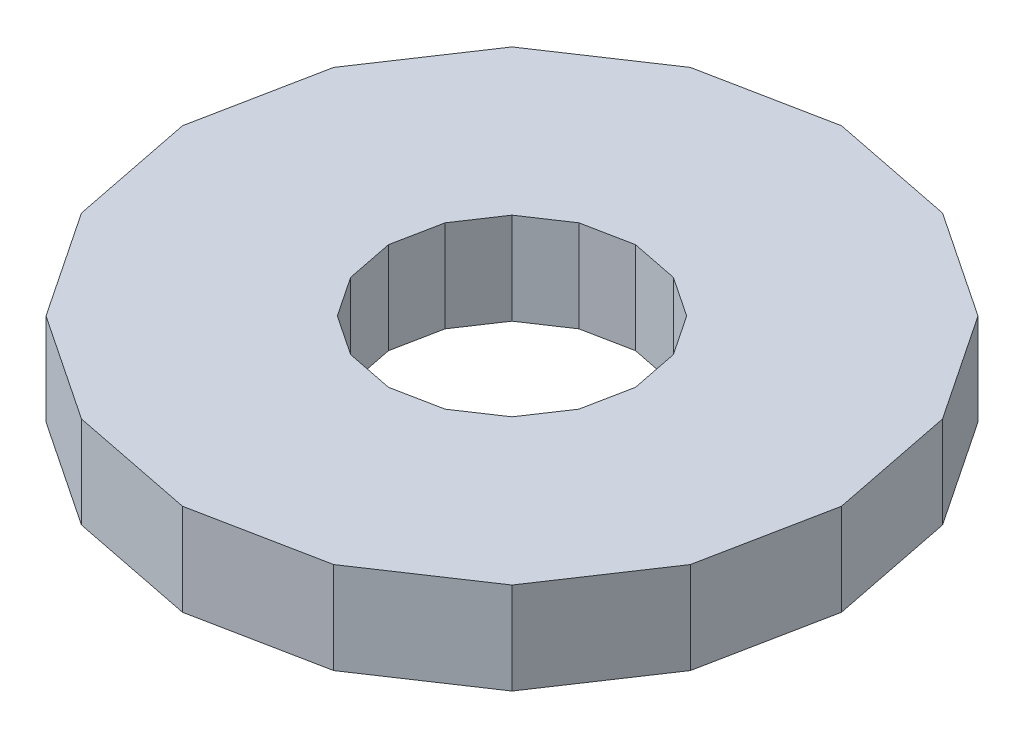
ISO-10303-21;
HEADER;
FILE_DESCRIPTION(('STEP AP214'),'2;1');
FILE_NAME('part.step','',(''),(''),'','','');
FILE_SCHEMA(('AUTOMOTIVE_DESIGN { 1 0 10303 214 1 1 1 1 }'));
ENDSEC;
DATA;
#1=APPLICATION_CONTEXT('core data for automotive mechanical design processes');
#2=APPLICATION_PROTOCOL_DEFINITION('international standard','automotive_design',2000,#1);
#3=PRODUCT_CONTEXT('',#1,'mechanical');
#4=PRODUCT('Part','Part','',(#3));
#5=PRODUCT_RELATED_PRODUCT_CATEGORY('part','',(#4));
#6=PRODUCT_DEFINITION_FORMATION('','',#4);
#7=PRODUCT_DEFINITION_CONTEXT('part definition',#1,'design');
#8=PRODUCT_DEFINITION('design','',#6,#7);
#9=PRODUCT_DEFINITION_SHAPE('','',#8);
#10=(LENGTH_UNIT() NAMED_UNIT(*) SI_UNIT(.MILLI.,.METRE.));
#11=(NAMED_UNIT(*) PLANE_ANGLE_UNIT() SI_UNIT($,.RADIAN.));
#12=(NAMED_UNIT(*) SI_UNIT($,.STERADIAN.) SOLID_ANGLE_UNIT());
#13=UNCERTAINTY_MEASURE_WITH_UNIT(LENGTH_MEASURE(1.E-05),#10,'distance_accuracy_value','');
#14=(GEOMETRIC_REPRESENTATION_CONTEXT(3) GLOBAL_UNCERTAINTY_ASSIGNED_CONTEXT((#13)) GLOBAL_UNIT_ASSIGNED_CONTEXT((#10,
#11,#12)) REPRESENTATION_CONTEXT('',''));
#15=CARTESIAN_POINT('',(0.,0.,0.));
#16=DIRECTION('',(0.,0.,1.));
#17=DIRECTION('',(1.,0.,0.));
#18=AXIS2_PLACEMENT_3D('',#15,#16,#17);
#19=CARTESIAN_POINT('',(0.,19.05,0.));
#20=DIRECTION('',(0.,1.,0.));
#21=DIRECTION('',(0.,0.,1.));
#22=AXIS2_PLACEMENT_3D('',#19,#20,#21);
#23=PLANE('',#22);
#24=DIRECTION('',(-0.195090322016128,0.,0.980785280403231));
#25=VECTOR('',#24,1.);
#26=CARTESIAN_POINT('',(-63.1498961030959,19.05,-26.1575434283542));
#27=LINE('',#26,#25);
#28=CARTESIAN_POINT('',(-63.1498961030959,19.05,-26.1575434283542));
#29=VERTEX_POINT('',#28);
#30=CARTESIAN_POINT('',(-68.352954991266,19.05,0.));
#31=VERTEX_POINT('',#30);
#32=EDGE_CURVE('E363',#29,#31,#27,.T.);
#33=ORIENTED_EDGE('',*,*,#32,.T.);
#34=DIRECTION('',(0.19509032201613,0.,0.98078528040323));
#35=VECTOR('',#34,1.);
#36=CARTESIAN_POINT('',(-68.352954991266,19.05,0.));
#37=LINE('',#36,#35);
#38=CARTESIAN_POINT('',(-63.1498961030958,19.05,26.1575434283542));
#39=VERTEX_POINT('',#38);
#40=EDGE_CURVE('E366',#31,#39,#37,.T.);
#41=ORIENTED_EDGE('',*,*,#40,.T.);
#42=DIRECTION('',(0.555570233019602,0.,0.831469612302545));
#43=VECTOR('',#42,1.);
#44=CARTESIAN_POINT('',(-63.1498961030958,19.05,26.1575434283542));
#45=LINE('',#44,#43);
#46=CARTESIAN_POINT('',(-48.3328379884631,19.05,48.3328379884631));
#47=VERTEX_POINT('',#46);
#48=EDGE_CURVE('E369',#39,#47,#45,.T.);
#49=ORIENTED_EDGE('',*,*,#48,.T.);
#50=DIRECTION('',(0.831469612302545,0.,0.555570233019602));
#51=VECTOR('',#50,1.);
#52=CARTESIAN_POINT('',(-48.3328379884631,19.05,48.3328379884631));
#53=LINE('',#52,#51);
#54=CARTESIAN_POINT('',(-26.1575434283542,19.05,63.1498961030958));
#55=VERTEX_POINT('',#54);
#56=EDGE_CURVE('E371',#47,#55,#53,.T.);
#57=ORIENTED_EDGE('',*,*,#56,.T.);
#58=DIRECTION('',(0.980785280403231,0.,0.195090322016127));
#59=VECTOR('',#58,1.);
#60=CARTESIAN_POINT('',(-26.1575434283542,19.05,63.1498961030958));
#61=LINE('',#60,#59);
#62=CARTESIAN_POINT('',(1.52321087825693E-13,19.05,68.352954991266));
#63=VERTEX_POINT('',#62);
#64=EDGE_CURVE('E373',#55,#63,#61,.T.);
#65=ORIENTED_EDGE('',*,*,#64,.T.);
#66=DIRECTION('',(0.98078528040323,0.,-0.195090322016128));
#67=VECTOR('',#66,1.);
#68=CARTESIAN_POINT('',(1.52321087825693E-13,19.05,68.352954991266));
#69=LINE('',#68,#67);
#70=CARTESIAN_POINT('',(26.1575434283542,19.05,63.1498961030959));
#71=VERTEX_POINT('',#70);
#72=EDGE_CURVE('E375',#63,#71,#69,.T.);
#73=ORIENTED_EDGE('',*,*,#72,.T.);
#74=DIRECTION('',(0.831469612302545,0.,-0.555570233019603));
#75=VECTOR('',#74,1.);
#76=CARTESIAN_POINT('',(26.1575434283542,19.05,63.1498961030959));
#77=LINE('',#76,#75);
#78=CARTESIAN_POINT('',(48.3328379884631,19.05,48.332837988463));
#79=VERTEX_POINT('',#78);
#80=EDGE_CURVE('E377',#71,#79,#77,.T.);
#81=ORIENTED_EDGE('',*,*,#80,.T.);
#82=DIRECTION('',(0.555570233019602,0.,-0.831469612302545));
#83=VECTOR('',#82,1.);
#84=CARTESIAN_POINT('',(48.3328379884631,19.05,48.332837988463));
#85=LINE('',#84,#83);
#86=CARTESIAN_POINT('',(63.1498961030958,19.05,26.1575434283543));
#87=VERTEX_POINT('',#86);
#88=EDGE_CURVE('E379',#79,#87,#85,.T.);
#89=ORIENTED_EDGE('',*,*,#88,.T.);
#90=DIRECTION('',(0.195090322016127,0.,-0.980785280403231));
#91=VECTOR('',#90,1.);
#92=CARTESIAN_POINT('',(63.1498961030958,19.05,26.1575434283543));
#93=LINE('',#92,#91);
#94=CARTESIAN_POINT('',(68.352954991266,19.05,-1.97560673503709E-13));
#95=VERTEX_POINT('',#94);
#96=EDGE_CURVE('E381',#87,#95,#93,.T.);
#97=ORIENTED_EDGE('',*,*,#96,.T.);
#98=DIRECTION('',(-0.195090322016129,0.,-0.98078528040323));
#99=VECTOR('',#98,1.);
#100=CARTESIAN_POINT('',(68.352954991266,19.05,-1.97560673503709E-13));
#101=LINE('',#100,#99);
#102=CARTESIAN_POINT('',(63.1498961030959,19.05,-26.1575434283542));
#103=VERTEX_POINT('',#102);
#104=EDGE_CURVE('E383',#95,#103,#101,.T.);
#105=ORIENTED_EDGE('',*,*,#104,.T.);
#106=DIRECTION('',(-0.555570233019602,0.,-0.831469612302545));
#107=VECTOR('',#106,1.);
#108=CARTESIAN_POINT('',(63.1498961030959,19.05,-26.1575434283542));
#109=LINE('',#108,#107);
#110=CARTESIAN_POINT('',(48.332837988463,19.05,-48.3328379884632));
#111=VERTEX_POINT('',#110);
#112=EDGE_CURVE('E385',#103,#111,#109,.T.);
#113=ORIENTED_EDGE('',*,*,#112,.T.);
#114=DIRECTION('',(-0.831469612302546,0.,-0.555570233019601));
#115=VECTOR('',#114,1.);
#116=CARTESIAN_POINT('',(48.332837988463,19.05,-48.3328379884632));
#117=LINE('',#116,#115);
#118=CARTESIAN_POINT('',(26.1575434283542,19.05,-63.1498961030959));
#119=VERTEX_POINT('',#118);
#120=EDGE_CURVE('E387',#111,#119,#117,.T.);
#121=ORIENTED_EDGE('',*,*,#120,.T.);
#122=DIRECTION('',(-0.98078528040323,0.,-0.195090322016128));
#123=VECTOR('',#122,1.);
#124=CARTESIAN_POINT('',(26.1575434283542,19.05,-63.1498961030959));
#125=LINE('',#124,#123);
#126=CARTESIAN_POINT('',(0.,19.05,-68.352954991266));
#127=VERTEX_POINT('',#126);
#128=EDGE_CURVE('E389',#119,#127,#125,.T.);
#129=ORIENTED_EDGE('',*,*,#128,.T.);
#130=DIRECTION('',(-0.980785280403231,0.,0.195090322016127));
#131=VECTOR('',#130,1.);
#132=CARTESIAN_POINT('',(0.,19.05,-68.352954991266));
#133=LINE('',#132,#131);
#134=CARTESIAN_POINT('',(-26.1575434283542,19.05,-63.1498961030959));
#135=VERTEX_POINT('',#134);
#136=EDGE_CURVE('E391',#127,#135,#133,.T.);
#137=ORIENTED_EDGE('',*,*,#136,.T.);
#138=DIRECTION('',(-0.831469612302545,0.,0.555570233019603));
#139=VECTOR('',#138,1.);
#140=CARTESIAN_POINT('',(-26.1575434283542,19.05,-63.1498961030959));
#141=LINE('',#140,#139);
#142=CARTESIAN_POINT('',(-48.3328379884631,19.05,-48.3328379884631));
#143=VERTEX_POINT('',#142);
#144=EDGE_CURVE('E393',#135,#143,#141,.T.);
#145=ORIENTED_EDGE('',*,*,#144,.T.);
#146=DIRECTION('',(-0.555570233019602,0.,0.831469612302545));
#147=VECTOR('',#146,1.);
#148=CARTESIAN_POINT('',(-48.3328379884631,19.05,-48.3328379884631));
#149=LINE('',#148,#147);
#150=EDGE_CURVE('E395',#143,#29,#149,.T.);
#151=ORIENTED_EDGE('',*,*,#150,.T.);
#152=EDGE_LOOP('',(#33,#41,#49,#57,#65,#73,#81,#89,#97,#105,#113,#121,#129,#137,#145,#151));
#153=FACE_BOUND('',#152,.T.);
#154=DIRECTION('',(0.195090322016129,0.,0.98078528040323));
#155=VECTOR('',#154,1.);
#156=CARTESIAN_POINT('',(-25.6218895507555,19.05,0.));
#157=LINE('',#156,#155);
#158=CARTESIAN_POINT('',(-25.6218895507555,19.05,0.));
#159=VERTEX_POINT('',#158);
#160=CARTESIAN_POINT('',(-23.6715393402078,19.05,9.80507263696235));
#161=VERTEX_POINT('',#160);
#162=EDGE_CURVE('E250',#159,#161,#157,.T.);
#163=ORIENTED_EDGE('',*,*,#162,.F.);
#164=DIRECTION('',(-0.195090322016128,0.,0.98078528040323));
#165=VECTOR('',#164,1.);
#166=CARTESIAN_POINT('',(-23.6715393402078,19.05,-9.80507263696232));
#167=LINE('',#166,#165);
#168=CARTESIAN_POINT('',(-23.6715393402078,19.05,-9.80507263696232));
#169=VERTEX_POINT('',#168);
#170=EDGE_CURVE('E242',#169,#159,#167,.T.);
#171=ORIENTED_EDGE('',*,*,#170,.F.);
#172=DIRECTION('',(-0.555570233019601,0.,0.831469612302546));
#173=VECTOR('',#172,1.);
#174=CARTESIAN_POINT('',(-18.1174118481519,19.05,-18.1174118481519));
#175=LINE('',#174,#173);
#176=CARTESIAN_POINT('',(-18.117411848152,19.05,-18.1174118481519));
#177=VERTEX_POINT('',#176);
#178=EDGE_CURVE('E291',#177,#169,#175,.T.);
#179=ORIENTED_EDGE('',*,*,#178,.F.);
#180=DIRECTION('',(-0.831469612302545,0.,0.555570233019602));
#181=VECTOR('',#180,1.);
#182=CARTESIAN_POINT('',(-9.80507263696235,19.05,-23.6715393402078));
#183=LINE('',#182,#181);
#184=CARTESIAN_POINT('',(-9.80507263696235,19.05,-23.6715393402078));
#185=VERTEX_POINT('',#184);
#186=EDGE_CURVE('E289',#185,#177,#183,.T.);
#187=ORIENTED_EDGE('',*,*,#186,.F.);
#188=DIRECTION('',(-0.98078528040323,0.,0.195090322016129));
#189=VECTOR('',#188,1.);
#190=CARTESIAN_POINT('',(0.,19.05,-25.6218895507555));
#191=LINE('',#190,#189);
#192=CARTESIAN_POINT('',(0.,19.05,-25.6218895507555));
#193=VERTEX_POINT('',#192);
#194=EDGE_CURVE('E287',#193,#185,#191,.T.);
#195=ORIENTED_EDGE('',*,*,#194,.F.);
#196=DIRECTION('',(-0.98078528040323,0.,-0.195090322016128));
#197=VECTOR('',#196,1.);
#198=CARTESIAN_POINT('',(9.80507263696232,19.05,-23.6715393402078));
#199=LINE('',#198,#197);
#200=CARTESIAN_POINT('',(9.80507263696232,19.05,-23.6715393402078));
#201=VERTEX_POINT('',#200);
#202=EDGE_CURVE('E285',#201,#193,#199,.T.);
#203=ORIENTED_EDGE('',*,*,#202,.F.);
#204=DIRECTION('',(-0.831469612302546,0.,-0.555570233019602));
#205=VECTOR('',#204,1.);
#206=CARTESIAN_POINT('',(18.1174118481519,19.05,-18.1174118481519));
#207=LINE('',#206,#205);
#208=CARTESIAN_POINT('',(18.1174118481519,19.05,-18.1174118481519));
#209=VERTEX_POINT('',#208);
#210=EDGE_CURVE('E283',#209,#201,#207,.T.);
#211=ORIENTED_EDGE('',*,*,#210,.F.);
#212=DIRECTION('',(-0.555570233019603,0.,-0.831469612302545));
#213=VECTOR('',#212,1.);
#214=CARTESIAN_POINT('',(23.6715393402078,19.05,-9.80507263696235));
#215=LINE('',#214,#213);
#216=CARTESIAN_POINT('',(23.6715393402078,19.05,-9.80507263696235));
#217=VERTEX_POINT('',#216);
#218=EDGE_CURVE('E281',#217,#209,#215,.T.);
#219=ORIENTED_EDGE('',*,*,#218,.F.);
#220=DIRECTION('',(-0.195090322016129,0.,-0.980785280403231));
#221=VECTOR('',#220,1.);
#222=CARTESIAN_POINT('',(25.6218895507555,19.05,0.));
#223=LINE('',#222,#221);
#224=CARTESIAN_POINT('',(25.6218895507555,19.05,0.));
#225=VERTEX_POINT('',#224);
#226=EDGE_CURVE('E279',#225,#217,#223,.T.);
#227=ORIENTED_EDGE('',*,*,#226,.F.);
#228=DIRECTION('',(0.195090322016128,0.,-0.98078528040323));
#229=VECTOR('',#228,1.);
#230=CARTESIAN_POINT('',(23.6715393402078,19.05,9.80507263696232));
#231=LINE('',#230,#229);
#232=CARTESIAN_POINT('',(23.6715393402078,19.05,9.80507263696232));
#233=VERTEX_POINT('',#232);
#234=EDGE_CURVE('E277',#233,#225,#231,.T.);
#235=ORIENTED_EDGE('',*,*,#234,.F.);
#236=DIRECTION('',(0.555570233019601,0.,-0.831469612302546));
#237=VECTOR('',#236,1.);
#238=CARTESIAN_POINT('',(18.117411848152,19.05,18.1174118481519));
#239=LINE('',#238,#237);
#240=CARTESIAN_POINT('',(18.117411848152,19.05,18.1174118481519));
#241=VERTEX_POINT('',#240);
#242=EDGE_CURVE('E275',#241,#233,#239,.T.);
#243=ORIENTED_EDGE('',*,*,#242,.F.);
#244=DIRECTION('',(0.831469612302545,0.,-0.555570233019603));
#245=VECTOR('',#244,1.);
#246=CARTESIAN_POINT('',(9.80507263696235,19.05,23.6715393402078));
#247=LINE('',#246,#245);
#248=CARTESIAN_POINT('',(9.80507263696235,19.05,23.6715393402078));
#249=VERTEX_POINT('',#248);
#250=EDGE_CURVE('E273',#249,#241,#247,.T.);
#251=ORIENTED_EDGE('',*,*,#250,.F.);
#252=DIRECTION('',(0.98078528040323,0.,-0.195090322016129));
#253=VECTOR('',#252,1.);
#254=CARTESIAN_POINT('',(0.,19.05,25.6218895507555));
#255=LINE('',#254,#253);
#256=CARTESIAN_POINT('',(0.,19.05,25.6218895507555));
#257=VERTEX_POINT('',#256);
#258=EDGE_CURVE('E271',#257,#249,#255,.T.);
#259=ORIENTED_EDGE('',*,*,#258,.F.);
#260=DIRECTION('',(0.98078528040323,0.,0.195090322016128));
#261=VECTOR('',#260,1.);
#262=CARTESIAN_POINT('',(-9.80507263696231,19.05,23.6715393402078));
#263=LINE('',#262,#261);
#264=CARTESIAN_POINT('',(-9.80507263696231,19.05,23.6715393402078));
#265=VERTEX_POINT('',#264);
#266=EDGE_CURVE('E269',#265,#257,#263,.T.);
#267=ORIENTED_EDGE('',*,*,#266,.F.);
#268=DIRECTION('',(0.831469612302546,0.,0.555570233019602));
#269=VECTOR('',#268,1.);
#270=CARTESIAN_POINT('',(-18.1174118481519,19.05,18.117411848152));
#271=LINE('',#270,#269);
#272=CARTESIAN_POINT('',(-18.1174118481519,19.05,18.117411848152));
#273=VERTEX_POINT('',#272);
#274=EDGE_CURVE('E265',#273,#265,#271,.T.);
#275=ORIENTED_EDGE('',*,*,#274,.F.);
#276=DIRECTION('',(0.555570233019603,0.,0.831469612302545));
#277=VECTOR('',#276,1.);
#278=CARTESIAN_POINT('',(-23.6715393402078,19.05,9.80507263696235));
#279=LINE('',#278,#277);
#280=EDGE_CURVE('E263',#161,#273,#279,.T.);
#281=ORIENTED_EDGE('',*,*,#280,.F.);
#282=EDGE_LOOP('',(#163,#171,#179,#187,#195,#203,#211,#219,#227,#235,#243,#251,#259,#267,#275,#281));
#283=FACE_BOUND('',#282,.T.);
#284=ADVANCED_FACE('F33',(#153,#283),#23,.T.);
#285=CARTESIAN_POINT('',(0.,0.,0.));
#286=DIRECTION('',(0.,1.,0.));
#287=DIRECTION('',(0.,0.,1.));
#288=AXIS2_PLACEMENT_3D('',#285,#286,#287);
#289=PLANE('',#288);
#290=DIRECTION('',(-0.195090322016128,0.,0.980785280403231));
#291=VECTOR('',#290,1.);
#292=CARTESIAN_POINT('',(-63.1498961030959,0.,-26.1575434283542));
#293=LINE('',#292,#291);
#294=CARTESIAN_POINT('',(-63.1498961030959,0.,-26.1575434283542));
#295=VERTEX_POINT('',#294);
#296=CARTESIAN_POINT('',(-68.352954991266,0.,0.));
#297=VERTEX_POINT('',#296);
#298=EDGE_CURVE('E258',#295,#297,#293,.T.);
#299=ORIENTED_EDGE('',*,*,#298,.F.);
#300=DIRECTION('',(-0.555570233019602,0.,0.831469612302545));
#301=VECTOR('',#300,1.);
#302=CARTESIAN_POINT('',(-48.3328379884631,0.,-48.3328379884631));
#303=LINE('',#302,#301);
#304=CARTESIAN_POINT('',(-48.3328379884631,0.,-48.3328379884631));
#305=VERTEX_POINT('',#304);
#306=EDGE_CURVE('E367',#305,#295,#303,.T.);
#307=ORIENTED_EDGE('',*,*,#306,.F.);
#308=DIRECTION('',(-0.831469612302545,0.,0.555570233019603));
#309=VECTOR('',#308,1.);
#310=CARTESIAN_POINT('',(-26.1575434283542,0.,-63.1498961030959));
#311=LINE('',#310,#309);
#312=CARTESIAN_POINT('',(-26.1575434283542,0.,-63.1498961030959));
#313=VERTEX_POINT('',#312);
#314=EDGE_CURVE('E426',#313,#305,#311,.T.);
#315=ORIENTED_EDGE('',*,*,#314,.F.);
#316=DIRECTION('',(-0.980785280403231,0.,0.195090322016127));
#317=VECTOR('',#316,1.);
#318=CARTESIAN_POINT('',(0.,0.,-68.352954991266));
#319=LINE('',#318,#317);
#320=CARTESIAN_POINT('',(0.,0.,-68.352954991266));
#321=VERTEX_POINT('',#320);
#322=EDGE_CURVE('E424',#321,#313,#319,.T.);
#323=ORIENTED_EDGE('',*,*,#322,.F.);
#324=DIRECTION('',(-0.98078528040323,0.,-0.195090322016128));
#325=VECTOR('',#324,1.);
#326=CARTESIAN_POINT('',(26.1575434283542,0.,-63.1498961030959));
#327=LINE('',#326,#325);
#328=CARTESIAN_POINT('',(26.1575434283542,0.,-63.1498961030959));
#329=VERTEX_POINT('',#328);
#330=EDGE_CURVE('E422',#329,#321,#327,.T.);
#331=ORIENTED_EDGE('',*,*,#330,.F.);
#332=DIRECTION('',(-0.831469612302546,0.,-0.555570233019601));
#333=VECTOR('',#332,1.);
#334=CARTESIAN_POINT('',(48.332837988463,0.,-48.3328379884632));
#335=LINE('',#334,#333);
#336=CARTESIAN_POINT('',(48.332837988463,0.,-48.3328379884632));
#337=VERTEX_POINT('',#336);
#338=EDGE_CURVE('E420',#337,#329,#335,.T.);
#339=ORIENTED_EDGE('',*,*,#338,.F.);
#340=DIRECTION('',(-0.555570233019602,0.,-0.831469612302545));
#341=VECTOR('',#340,1.);
#342=CARTESIAN_POINT('',(63.1498961030959,0.,-26.1575434283542));
#343=LINE('',#342,#341);
#344=CARTESIAN_POINT('',(63.1498961030959,0.,-26.1575434283542));
#345=VERTEX_POINT('',#344);
#346=EDGE_CURVE('E418',#345,#337,#343,.T.);
#347=ORIENTED_EDGE('',*,*,#346,.F.);
#348=DIRECTION('',(-0.195090322016129,0.,-0.98078528040323));
#349=VECTOR('',#348,1.);
#350=CARTESIAN_POINT('',(68.352954991266,0.,-1.97560673503709E-13));
#351=LINE('',#350,#349);
#352=CARTESIAN_POINT('',(68.352954991266,0.,-1.97560673503709E-13));
#353=VERTEX_POINT('',#352);
#354=EDGE_CURVE('E416',#353,#345,#351,.T.);
#355=ORIENTED_EDGE('',*,*,#354,.F.);
#356=DIRECTION('',(0.195090322016127,0.,-0.980785280403231));
#357=VECTOR('',#356,1.);
#358=CARTESIAN_POINT('',(63.1498961030958,0.,26.1575434283543));
#359=LINE('',#358,#357);
#360=CARTESIAN_POINT('',(63.1498961030958,0.,26.1575434283543));
#361=VERTEX_POINT('',#360);
#362=EDGE_CURVE('E414',#361,#353,#359,.T.);
#363=ORIENTED_EDGE('',*,*,#362,.F.);
#364=DIRECTION('',(0.555570233019602,0.,-0.831469612302545));
#365=VECTOR('',#364,1.);
#366=CARTESIAN_POINT('',(48.3328379884631,0.,48.332837988463));
#367=LINE('',#366,#365);
#368=CARTESIAN_POINT('',(48.3328379884631,0.,48.332837988463));
#369=VERTEX_POINT('',#368);
#370=EDGE_CURVE('E412',#369,#361,#367,.T.);
#371=ORIENTED_EDGE('',*,*,#370,.F.);
#372=DIRECTION('',(0.831469612302545,0.,-0.555570233019603));
#373=VECTOR('',#372,1.);
#374=CARTESIAN_POINT('',(26.1575434283542,0.,63.1498961030959));
#375=LINE('',#374,#373);
#376=CARTESIAN_POINT('',(26.1575434283542,0.,63.1498961030959));
#377=VERTEX_POINT('',#376);
#378=EDGE_CURVE('E410',#377,#369,#375,.T.);
#379=ORIENTED_EDGE('',*,*,#378,.F.);
#380=DIRECTION('',(0.98078528040323,0.,-0.195090322016128));
#381=VECTOR('',#380,1.);
#382=CARTESIAN_POINT('',(1.52321087825693E-13,0.,68.352954991266));
#383=LINE('',#382,#381);
#384=CARTESIAN_POINT('',(1.52321087825693E-13,0.,68.352954991266));
#385=VERTEX_POINT('',#384);
#386=EDGE_CURVE('E408',#385,#377,#383,.T.);
#387=ORIENTED_EDGE('',*,*,#386,.F.);
#388=DIRECTION('',(0.980785280403231,0.,0.195090322016127));
#389=VECTOR('',#388,1.);
#390=CARTESIAN_POINT('',(-26.1575434283542,0.,63.1498961030958));
#391=LINE('',#390,#389);
#392=CARTESIAN_POINT('',(-26.1575434283542,0.,63.1498961030958));
#393=VERTEX_POINT('',#392);
#394=EDGE_CURVE('E406',#393,#385,#391,.T.);
#395=ORIENTED_EDGE('',*,*,#394,.F.);
#396=DIRECTION('',(0.831469612302545,0.,0.555570233019602));
#397=VECTOR('',#396,1.);
#398=CARTESIAN_POINT('',(-48.3328379884631,0.,48.3328379884631));
#399=LINE('',#398,#397);
#400=CARTESIAN_POINT('',(-48.3328379884631,0.,48.3328379884631));
#401=VERTEX_POINT('',#400);
#402=EDGE_CURVE('E404',#401,#393,#399,.T.);
#403=ORIENTED_EDGE('',*,*,#402,.F.);
#404=DIRECTION('',(0.555570233019602,0.,0.831469612302545));
#405=VECTOR('',#404,1.);
#406=CARTESIAN_POINT('',(-63.1498961030958,0.,26.1575434283542));
#407=LINE('',#406,#405);
#408=CARTESIAN_POINT('',(-63.1498961030958,0.,26.1575434283542));
#409=VERTEX_POINT('',#408);
#410=EDGE_CURVE('E402',#409,#401,#407,.T.);
#411=ORIENTED_EDGE('',*,*,#410,.F.);
#412=DIRECTION('',(0.19509032201613,0.,0.98078528040323));
#413=VECTOR('',#412,1.);
#414=CARTESIAN_POINT('',(-68.352954991266,0.,0.));
#415=LINE('',#414,#413);
#416=EDGE_CURVE('E400',#297,#409,#415,.T.);
#417=ORIENTED_EDGE('',*,*,#416,.F.);
#418=EDGE_LOOP('',(#299,#307,#315,#323,#331,#339,#347,#355,#363,#371,#379,#387,#395,#403,#411,#417));
#419=FACE_BOUND('',#418,.T.);
#420=DIRECTION('',(-0.195090322016128,0.,0.98078528040323));
#421=VECTOR('',#420,1.);
#422=CARTESIAN_POINT('',(-23.6715393402078,0.,-9.80507263696232));
#423=LINE('',#422,#421);
#424=CARTESIAN_POINT('',(-23.6715393402078,0.,-9.80507263696232));
#425=VERTEX_POINT('',#424);
#426=CARTESIAN_POINT('',(-25.6218895507555,0.,0.));
#427=VERTEX_POINT('',#426);
#428=EDGE_CURVE('E56',#425,#427,#423,.T.);
#429=ORIENTED_EDGE('',*,*,#428,.T.);
#430=DIRECTION('',(0.195090322016129,0.,0.98078528040323));
#431=VECTOR('',#430,1.);
#432=CARTESIAN_POINT('',(-25.6218895507555,0.,0.));
#433=LINE('',#432,#431);
#434=CARTESIAN_POINT('',(-23.6715393402078,0.,9.80507263696235));
#435=VERTEX_POINT('',#434);
#436=EDGE_CURVE('E257',#427,#435,#433,.T.);
#437=ORIENTED_EDGE('',*,*,#436,.T.);
#438=DIRECTION('',(0.555570233019603,0.,0.831469612302545));
#439=VECTOR('',#438,1.);
#440=CARTESIAN_POINT('',(-23.6715393402078,0.,9.80507263696235));
#441=LINE('',#440,#439);
#442=CARTESIAN_POINT('',(-18.1174118481519,0.,18.117411848152));
#443=VERTEX_POINT('',#442);
#444=EDGE_CURVE('E295',#435,#443,#441,.T.);
#445=ORIENTED_EDGE('',*,*,#444,.T.);
#446=DIRECTION('',(0.831469612302546,0.,0.555570233019602));
#447=VECTOR('',#446,1.);
#448=CARTESIAN_POINT('',(-18.1174118481519,0.,18.117411848152));
#449=LINE('',#448,#447);
#450=CARTESIAN_POINT('',(-9.80507263696231,0.,23.6715393402078));
#451=VERTEX_POINT('',#450);
#452=EDGE_CURVE('E298',#443,#451,#449,.T.);
#453=ORIENTED_EDGE('',*,*,#452,.T.);
#454=DIRECTION('',(0.98078528040323,0.,0.195090322016128));
#455=VECTOR('',#454,1.);
#456=CARTESIAN_POINT('',(-9.80507263696231,0.,23.6715393402078));
#457=LINE('',#456,#455);
#458=CARTESIAN_POINT('',(0.,0.,25.6218895507555));
#459=VERTEX_POINT('',#458);
#460=EDGE_CURVE('E301',#451,#459,#457,.T.);
#461=ORIENTED_EDGE('',*,*,#460,.T.);
#462=DIRECTION('',(0.98078528040323,0.,-0.195090322016129));
#463=VECTOR('',#462,1.);
#464=CARTESIAN_POINT('',(0.,0.,25.6218895507555));
#465=LINE('',#464,#463);
#466=CARTESIAN_POINT('',(9.80507263696235,0.,23.6715393402078));
#467=VERTEX_POINT('',#466);
#468=EDGE_CURVE('E304',#459,#467,#465,.T.);
#469=ORIENTED_EDGE('',*,*,#468,.T.);
#470=DIRECTION('',(0.831469612302545,0.,-0.555570233019603));
#471=VECTOR('',#470,1.);
#472=CARTESIAN_POINT('',(9.80507263696235,0.,23.6715393402078));
#473=LINE('',#472,#471);
#474=CARTESIAN_POINT('',(18.117411848152,0.,18.1174118481519));
#475=VERTEX_POINT('',#474);
#476=EDGE_CURVE('E307',#467,#475,#473,.T.);
#477=ORIENTED_EDGE('',*,*,#476,.T.);
#478=DIRECTION('',(0.555570233019601,0.,-0.831469612302546));
#479=VECTOR('',#478,1.);
#480=CARTESIAN_POINT('',(18.117411848152,0.,18.1174118481519));
#481=LINE('',#480,#479);
#482=CARTESIAN_POINT('',(23.6715393402078,0.,9.80507263696232));
#483=VERTEX_POINT('',#482);
#484=EDGE_CURVE('E310',#475,#483,#481,.T.);
#485=ORIENTED_EDGE('',*,*,#484,.T.);
#486=DIRECTION('',(0.195090322016128,0.,-0.98078528040323));
#487=VECTOR('',#486,1.);
#488=CARTESIAN_POINT('',(23.6715393402078,0.,9.80507263696232));
#489=LINE('',#488,#487);
#490=CARTESIAN_POINT('',(25.6218895507555,0.,0.));
#491=VERTEX_POINT('',#490);
#492=EDGE_CURVE('E313',#483,#491,#489,.T.);
#493=ORIENTED_EDGE('',*,*,#492,.T.);
#494=DIRECTION('',(-0.195090322016129,0.,-0.980785280403231));
#495=VECTOR('',#494,1.);
#496=CARTESIAN_POINT('',(25.6218895507555,0.,0.));
#497=LINE('',#496,#495);
#498=CARTESIAN_POINT('',(23.6715393402078,0.,-9.80507263696235));
#499=VERTEX_POINT('',#498);
#500=EDGE_CURVE('E316',#491,#499,#497,.T.);
#501=ORIENTED_EDGE('',*,*,#500,.T.);
#502=DIRECTION('',(-0.555570233019603,0.,-0.831469612302545));
#503=VECTOR('',#502,1.);
#504=CARTESIAN_POINT('',(23.6715393402078,0.,-9.80507263696235));
#505=LINE('',#504,#503);
#506=CARTESIAN_POINT('',(18.1174118481519,0.,-18.1174118481519));
#507=VERTEX_POINT('',#506);
#508=EDGE_CURVE('E319',#499,#507,#505,.T.);
#509=ORIENTED_EDGE('',*,*,#508,.T.);
#510=DIRECTION('',(-0.831469612302546,0.,-0.555570233019602));
#511=VECTOR('',#510,1.);
#512=CARTESIAN_POINT('',(18.1174118481519,0.,-18.1174118481519));
#513=LINE('',#512,#511);
#514=CARTESIAN_POINT('',(9.80507263696232,0.,-23.6715393402078));
#515=VERTEX_POINT('',#514);
#516=EDGE_CURVE('E322',#507,#515,#513,.T.);
#517=ORIENTED_EDGE('',*,*,#516,.T.);
#518=DIRECTION('',(-0.98078528040323,0.,-0.195090322016128));
#519=VECTOR('',#518,1.);
#520=CARTESIAN_POINT('',(9.80507263696232,0.,-23.6715393402078));
#521=LINE('',#520,#519);
#522=CARTESIAN_POINT('',(0.,0.,-25.6218895507555));
#523=VERTEX_POINT('',#522);
#524=EDGE_CURVE('E325',#515,#523,#521,.T.);
#525=ORIENTED_EDGE('',*,*,#524,.T.);
#526=DIRECTION('',(-0.98078528040323,0.,0.195090322016129));
#527=VECTOR('',#526,1.);
#528=CARTESIAN_POINT('',(0.,0.,-25.6218895507555));
#529=LINE('',#528,#527);
#530=CARTESIAN_POINT('',(-9.80507263696235,0.,-23.6715393402078));
#531=VERTEX_POINT('',#530);
#532=EDGE_CURVE('E328',#523,#531,#529,.T.);
#533=ORIENTED_EDGE('',*,*,#532,.T.);
#534=DIRECTION('',(-0.831469612302545,0.,0.555570233019602));
#535=VECTOR('',#534,1.);
#536=CARTESIAN_POINT('',(-9.80507263696235,0.,-23.6715393402078));
#537=LINE('',#536,#535);
#538=CARTESIAN_POINT('',(-18.1174118481519,0.,-18.1174118481519));
#539=VERTEX_POINT('',#538);
#540=EDGE_CURVE('E331',#531,#539,#537,.T.);
#541=ORIENTED_EDGE('',*,*,#540,.T.);
#542=DIRECTION('',(-0.555570233019601,0.,0.831469612302546));
#543=VECTOR('',#542,1.);
#544=CARTESIAN_POINT('',(-18.1174118481519,0.,-18.1174118481519));
#545=LINE('',#544,#543);
#546=EDGE_CURVE('E251',#539,#425,#545,.T.);
#547=ORIENTED_EDGE('',*,*,#546,.T.);
#548=EDGE_LOOP('',(#429,#437,#445,#453,#461,#469,#477,#485,#493,#501,#509,#517,#525,#533,#541,#547));
#549=FACE_BOUND('',#548,.T.);
#550=ADVANCED_FACE('F480',(#419,#549),#289,.F.);
#551=CARTESIAN_POINT('',(-63.1498961030959,19.05,-26.1575434283542));
#552=DIRECTION('',(0.98078528040323,0.,0.195090322016128));
#553=DIRECTION('',(0.195090322016128,0.,-0.980785280403231));
#554=AXIS2_PLACEMENT_3D('',#551,#552,#553);
#555=PLANE('',#554);
#556=ORIENTED_EDGE('',*,*,#298,.T.);
#557=DIRECTION('',(0.,-1.,0.));
#558=VECTOR('',#557,1.);
#559=CARTESIAN_POINT('',(-68.352954991266,19.05,0.));
#560=LINE('',#559,#558);
#561=EDGE_CURVE('E11',#31,#297,#560,.T.);
#562=ORIENTED_EDGE('',*,*,#561,.F.);
#563=ORIENTED_EDGE('',*,*,#32,.F.);
#564=DIRECTION('',(0.,-1.,0.));
#565=VECTOR('',#564,1.);
#566=CARTESIAN_POINT('',(-63.1498961030959,19.05,-26.1575434283542));
#567=LINE('',#566,#565);
#568=EDGE_CURVE('E397',#29,#295,#567,.T.);
#569=ORIENTED_EDGE('',*,*,#568,.T.);
#570=EDGE_LOOP('',(#556,#562,#563,#569));
#571=FACE_BOUND('',#570,.T.);
#572=ADVANCED_FACE('F35',(#571),#555,.F.);
#573=CARTESIAN_POINT('',(-68.352954991266,19.05,0.));
#574=DIRECTION('',(0.98078528040323,0.,-0.19509032201613));
#575=DIRECTION('',(-0.19509032201613,0.,-0.98078528040323));
#576=AXIS2_PLACEMENT_3D('',#573,#574,#575);
#577=PLANE('',#576);
#578=ORIENTED_EDGE('',*,*,#416,.T.);
#579=DIRECTION('',(0.,-1.,0.));
#580=VECTOR('',#579,1.);
#581=CARTESIAN_POINT('',(-63.1498961030958,19.05,26.1575434283542));
#582=LINE('',#581,#580);
#583=EDGE_CURVE('E41',#39,#409,#582,.T.);
#584=ORIENTED_EDGE('',*,*,#583,.F.);
#585=ORIENTED_EDGE('',*,*,#40,.F.);
#586=ORIENTED_EDGE('',*,*,#561,.T.);
#587=EDGE_LOOP('',(#578,#584,#585,#586));
#588=FACE_BOUND('',#587,.T.);
#589=ADVANCED_FACE('F497',(#588),#577,.F.);
#590=CARTESIAN_POINT('',(-63.1498961030958,19.05,26.1575434283542));
#591=DIRECTION('',(0.831469612302545,0.,-0.555570233019602));
#592=DIRECTION('',(-0.555570233019602,0.,-0.831469612302545));
#593=AXIS2_PLACEMENT_3D('',#590,#591,#592);
#594=PLANE('',#593);
#595=ORIENTED_EDGE('',*,*,#410,.T.);
#596=DIRECTION('',(0.,-1.,0.));
#597=VECTOR('',#596,1.);
#598=CARTESIAN_POINT('',(-48.3328379884631,19.05,48.3328379884631));
#599=LINE('',#598,#597);
#600=EDGE_CURVE('E467',#47,#401,#599,.T.);
#601=ORIENTED_EDGE('',*,*,#600,.F.);
#602=ORIENTED_EDGE('',*,*,#48,.F.);
#603=ORIENTED_EDGE('',*,*,#583,.T.);
#604=EDGE_LOOP('',(#595,#601,#602,#603));
#605=FACE_BOUND('',#604,.T.);
#606=ADVANCED_FACE('F474',(#605),#594,.F.);
#607=CARTESIAN_POINT('',(-48.3328379884631,19.05,48.3328379884631));
#608=DIRECTION('',(0.555570233019602,0.,-0.831469612302545));
#609=DIRECTION('',(-0.831469612302545,0.,-0.555570233019602));
#610=AXIS2_PLACEMENT_3D('',#607,#608,#609);
#611=PLANE('',#610);
#612=ORIENTED_EDGE('',*,*,#402,.T.);
#613=DIRECTION('',(0.,-1.,0.));
#614=VECTOR('',#613,1.);
#615=CARTESIAN_POINT('',(-26.1575434283542,19.05,63.1498961030958));
#616=LINE('',#615,#614);
#617=EDGE_CURVE('E464',#55,#393,#616,.T.);
#618=ORIENTED_EDGE('',*,*,#617,.F.);
#619=ORIENTED_EDGE('',*,*,#56,.F.);
#620=ORIENTED_EDGE('',*,*,#600,.T.);
#621=EDGE_LOOP('',(#612,#618,#619,#620));
#622=FACE_BOUND('',#621,.T.);
#623=ADVANCED_FACE('F486',(#622),#611,.F.);
#624=CARTESIAN_POINT('',(-26.1575434283542,19.05,63.1498961030958));
#625=DIRECTION('',(0.195090322016127,0.,-0.980785280403231));
#626=DIRECTION('',(-0.980785280403231,0.,-0.195090322016127));
#627=AXIS2_PLACEMENT_3D('',#624,#625,#626);
#628=PLANE('',#627);
#629=ORIENTED_EDGE('',*,*,#394,.T.);
#630=DIRECTION('',(0.,-1.,0.));
#631=VECTOR('',#630,1.);
#632=CARTESIAN_POINT('',(1.52321087825693E-13,19.05,68.352954991266));
#633=LINE('',#632,#631);
#634=EDGE_CURVE('E461',#63,#385,#633,.T.);
#635=ORIENTED_EDGE('',*,*,#634,.F.);
#636=ORIENTED_EDGE('',*,*,#64,.F.);
#637=ORIENTED_EDGE('',*,*,#617,.T.);
#638=EDGE_LOOP('',(#629,#635,#636,#637));
#639=FACE_BOUND('',#638,.T.);
#640=ADVANCED_FACE('F490',(#639),#628,.F.);
#641=CARTESIAN_POINT('',(1.52321087825693E-13,19.05,68.352954991266));
#642=DIRECTION('',(-0.195090322016128,0.,-0.98078528040323));
#643=DIRECTION('',(-0.98078528040323,0.,0.195090322016128));
#644=AXIS2_PLACEMENT_3D('',#641,#642,#643);
#645=PLANE('',#644);
#646=ORIENTED_EDGE('',*,*,#386,.T.);
#647=DIRECTION('',(0.,-1.,0.));
#648=VECTOR('',#647,1.);
#649=CARTESIAN_POINT('',(26.1575434283542,19.05,63.1498961030959));
#650=LINE('',#649,#648);
#651=EDGE_CURVE('E458',#71,#377,#650,.T.);
#652=ORIENTED_EDGE('',*,*,#651,.F.);
#653=ORIENTED_EDGE('',*,*,#72,.F.);
#654=ORIENTED_EDGE('',*,*,#634,.T.);
#655=EDGE_LOOP('',(#646,#652,#653,#654));
#656=FACE_BOUND('',#655,.T.);
#657=ADVANCED_FACE('F550',(#656),#645,.F.);
#658=CARTESIAN_POINT('',(26.1575434283542,19.05,63.1498961030959));
#659=DIRECTION('',(-0.555570233019602,0.,-0.831469612302545));
#660=DIRECTION('',(-0.831469612302545,0.,0.555570233019602));
#661=AXIS2_PLACEMENT_3D('',#658,#659,#660);
#662=PLANE('',#661);
#663=ORIENTED_EDGE('',*,*,#378,.T.);
#664=DIRECTION('',(0.,-1.,0.));
#665=VECTOR('',#664,1.);
#666=CARTESIAN_POINT('',(48.3328379884631,19.05,48.332837988463));
#667=LINE('',#666,#665);
#668=EDGE_CURVE('E455',#79,#369,#667,.T.);
#669=ORIENTED_EDGE('',*,*,#668,.F.);
#670=ORIENTED_EDGE('',*,*,#80,.F.);
#671=ORIENTED_EDGE('',*,*,#651,.T.);
#672=EDGE_LOOP('',(#663,#669,#670,#671));
#673=FACE_BOUND('',#672,.T.);
#674=ADVANCED_FACE('F547',(#673),#662,.F.);
#675=CARTESIAN_POINT('',(48.3328379884631,19.05,48.332837988463));
#676=DIRECTION('',(-0.831469612302545,0.,-0.555570233019602));
#677=DIRECTION('',(-0.555570233019602,0.,0.831469612302545));
#678=AXIS2_PLACEMENT_3D('',#675,#676,#677);
#679=PLANE('',#678);
#680=ORIENTED_EDGE('',*,*,#370,.T.);
#681=DIRECTION('',(0.,-1.,0.));
#682=VECTOR('',#681,1.);
#683=CARTESIAN_POINT('',(63.1498961030958,19.05,26.1575434283543));
#684=LINE('',#683,#682);
#685=EDGE_CURVE('E452',#87,#361,#684,.T.);
#686=ORIENTED_EDGE('',*,*,#685,.F.);
#687=ORIENTED_EDGE('',*,*,#88,.F.);
#688=ORIENTED_EDGE('',*,*,#668,.T.);
#689=EDGE_LOOP('',(#680,#686,#687,#688));
#690=FACE_BOUND('',#689,.T.);
#691=ADVANCED_FACE('F543',(#690),#679,.F.);
#692=CARTESIAN_POINT('',(63.1498961030958,19.05,26.1575434283543));
#693=DIRECTION('',(-0.980785280403231,0.,-0.195090322016127));
#694=DIRECTION('',(-0.195090322016127,0.,0.980785280403231));
#695=AXIS2_PLACEMENT_3D('',#692,#693,#694);
#696=PLANE('',#695);
#697=ORIENTED_EDGE('',*,*,#362,.T.);
#698=DIRECTION('',(0.,-1.,0.));
#699=VECTOR('',#698,1.);
#700=CARTESIAN_POINT('',(68.352954991266,19.05,-1.97560673503709E-13));
#701=LINE('',#700,#699);
#702=EDGE_CURVE('E449',#95,#353,#701,.T.);
#703=ORIENTED_EDGE('',*,*,#702,.F.);
#704=ORIENTED_EDGE('',*,*,#96,.F.);
#705=ORIENTED_EDGE('',*,*,#685,.T.);
#706=EDGE_LOOP('',(#697,#703,#704,#705));
#707=FACE_BOUND('',#706,.T.);
#708=ADVANCED_FACE('F539',(#707),#696,.F.);
#709=CARTESIAN_POINT('',(68.352954991266,19.05,-1.97560673503709E-13));
#710=DIRECTION('',(-0.98078528040323,0.,0.195090322016129));
#711=DIRECTION('',(0.195090322016129,0.,0.98078528040323));
#712=AXIS2_PLACEMENT_3D('',#709,#710,#711);
#713=PLANE('',#712);
#714=ORIENTED_EDGE('',*,*,#354,.T.);
#715=DIRECTION('',(0.,-1.,0.));
#716=VECTOR('',#715,1.);
#717=CARTESIAN_POINT('',(63.1498961030959,19.05,-26.1575434283542));
#718=LINE('',#717,#716);
#719=EDGE_CURVE('E446',#103,#345,#718,.T.);
#720=ORIENTED_EDGE('',*,*,#719,.F.);
#721=ORIENTED_EDGE('',*,*,#104,.F.);
#722=ORIENTED_EDGE('',*,*,#702,.T.);
#723=EDGE_LOOP('',(#714,#720,#721,#722));
#724=FACE_BOUND('',#723,.T.);
#725=ADVANCED_FACE('F534',(#724),#713,.F.);
#726=CARTESIAN_POINT('',(63.1498961030959,19.05,-26.1575434283542));
#727=DIRECTION('',(-0.831469612302545,0.,0.555570233019603));
#728=DIRECTION('',(0.555570233019603,0.,0.831469612302545));
#729=AXIS2_PLACEMENT_3D('',#726,#727,#728);
#730=PLANE('',#729);
#731=ORIENTED_EDGE('',*,*,#346,.T.);
#732=DIRECTION('',(0.,-1.,0.));
#733=VECTOR('',#732,1.);
#734=CARTESIAN_POINT('',(48.332837988463,19.05,-48.3328379884632));
#735=LINE('',#734,#733);
#736=EDGE_CURVE('E443',#111,#337,#735,.T.);
#737=ORIENTED_EDGE('',*,*,#736,.F.);
#738=ORIENTED_EDGE('',*,*,#112,.F.);
#739=ORIENTED_EDGE('',*,*,#719,.T.);
#740=EDGE_LOOP('',(#731,#737,#738,#739));
#741=FACE_BOUND('',#740,.T.);
#742=ADVANCED_FACE('F528',(#741),#730,.F.);
#743=CARTESIAN_POINT('',(48.332837988463,19.05,-48.3328379884632));
#744=DIRECTION('',(-0.555570233019601,0.,0.831469612302546));
#745=DIRECTION('',(0.831469612302546,0.,0.555570233019601));
#746=AXIS2_PLACEMENT_3D('',#743,#744,#745);
#747=PLANE('',#746);
#748=ORIENTED_EDGE('',*,*,#338,.T.);
#749=DIRECTION('',(0.,-1.,0.));
#750=VECTOR('',#749,1.);
#751=CARTESIAN_POINT('',(26.1575434283542,19.05,-63.1498961030959));
#752=LINE('',#751,#750);
#753=EDGE_CURVE('E440',#119,#329,#752,.T.);
#754=ORIENTED_EDGE('',*,*,#753,.F.);
#755=ORIENTED_EDGE('',*,*,#120,.F.);
#756=ORIENTED_EDGE('',*,*,#736,.T.);
#757=EDGE_LOOP('',(#748,#754,#755,#756));
#758=FACE_BOUND('',#757,.T.);
#759=ADVANCED_FACE('F524',(#758),#747,.F.);
#760=CARTESIAN_POINT('',(26.1575434283542,19.05,-63.1498961030959));
#761=DIRECTION('',(-0.195090322016128,0.,0.980785280403231));
#762=DIRECTION('',(0.98078528040323,0.,0.195090322016128));
#763=AXIS2_PLACEMENT_3D('',#760,#761,#762);
#764=PLANE('',#763);
#765=ORIENTED_EDGE('',*,*,#330,.T.);
#766=DIRECTION('',(0.,-1.,0.));
#767=VECTOR('',#766,1.);
#768=CARTESIAN_POINT('',(0.,19.05,-68.352954991266));
#769=LINE('',#768,#767);
#770=EDGE_CURVE('E437',#127,#321,#769,.T.);
#771=ORIENTED_EDGE('',*,*,#770,.F.);
#772=ORIENTED_EDGE('',*,*,#128,.F.);
#773=ORIENTED_EDGE('',*,*,#753,.T.);
#774=EDGE_LOOP('',(#765,#771,#772,#773));
#775=FACE_BOUND('',#774,.T.);
#776=ADVANCED_FACE('F519',(#775),#764,.F.);
#777=CARTESIAN_POINT('',(0.,19.05,-68.352954991266));
#778=DIRECTION('',(0.195090322016127,0.,0.980785280403231));
#779=DIRECTION('',(0.980785280403231,0.,-0.195090322016127));
#780=AXIS2_PLACEMENT_3D('',#777,#778,#779);
#781=PLANE('',#780);
#782=ORIENTED_EDGE('',*,*,#322,.T.);
#783=DIRECTION('',(0.,-1.,0.));
#784=VECTOR('',#783,1.);
#785=CARTESIAN_POINT('',(-26.1575434283542,19.05,-63.1498961030959));
#786=LINE('',#785,#784);
#787=EDGE_CURVE('E434',#135,#313,#786,.T.);
#788=ORIENTED_EDGE('',*,*,#787,.F.);
#789=ORIENTED_EDGE('',*,*,#136,.F.);
#790=ORIENTED_EDGE('',*,*,#770,.T.);
#791=EDGE_LOOP('',(#782,#788,#789,#790));
#792=FACE_BOUND('',#791,.T.);
#793=ADVANCED_FACE('F513',(#792),#781,.F.);
#794=CARTESIAN_POINT('',(-26.1575434283542,19.05,-63.1498961030959));
#795=DIRECTION('',(0.555570233019603,0.,0.831469612302545));
#796=DIRECTION('',(0.831469612302545,0.,-0.555570233019603));
#797=AXIS2_PLACEMENT_3D('',#794,#795,#796);
#798=PLANE('',#797);
#799=ORIENTED_EDGE('',*,*,#314,.T.);
#800=DIRECTION('',(0.,-1.,0.));
#801=VECTOR('',#800,1.);
#802=CARTESIAN_POINT('',(-48.3328379884631,19.05,-48.3328379884631));
#803=LINE('',#802,#801);
#804=EDGE_CURVE('E431',#143,#305,#803,.T.);
#805=ORIENTED_EDGE('',*,*,#804,.F.);
#806=ORIENTED_EDGE('',*,*,#144,.F.);
#807=ORIENTED_EDGE('',*,*,#787,.T.);
#808=EDGE_LOOP('',(#799,#805,#806,#807));
#809=FACE_BOUND('',#808,.T.);
#810=ADVANCED_FACE('F509',(#809),#798,.F.);
#811=CARTESIAN_POINT('',(-48.3328379884631,19.05,-48.3328379884631));
#812=DIRECTION('',(0.831469612302545,0.,0.555570233019602));
#813=DIRECTION('',(0.555570233019602,0.,-0.831469612302545));
#814=AXIS2_PLACEMENT_3D('',#811,#812,#813);
#815=PLANE('',#814);
#816=ORIENTED_EDGE('',*,*,#306,.T.);
#817=ORIENTED_EDGE('',*,*,#568,.F.);
#818=ORIENTED_EDGE('',*,*,#150,.F.);
#819=ORIENTED_EDGE('',*,*,#804,.T.);
#820=EDGE_LOOP('',(#816,#817,#818,#819));
#821=FACE_BOUND('',#820,.T.);
#822=ADVANCED_FACE('F504',(#821),#815,.F.);
#823=CARTESIAN_POINT('',(-23.6715393402078,19.05,-9.80507263696232));
#824=DIRECTION('',(0.98078528040323,0.,0.195090322016128));
#825=DIRECTION('',(0.195090322016129,0.,-0.980785280403231));
#826=AXIS2_PLACEMENT_3D('',#823,#824,#825);
#827=PLANE('',#826);
#828=ORIENTED_EDGE('',*,*,#428,.F.);
#829=DIRECTION('',(0.,-1.,0.));
#830=VECTOR('',#829,1.);
#831=CARTESIAN_POINT('',(-23.6715393402078,19.05,-9.80507263696232));
#832=LINE('',#831,#830);
#833=EDGE_CURVE('E246',#169,#425,#832,.T.);
#834=ORIENTED_EDGE('',*,*,#833,.F.);
#835=ORIENTED_EDGE('',*,*,#170,.T.);
#836=DIRECTION('',(0.,-1.,0.));
#837=VECTOR('',#836,1.);
#838=CARTESIAN_POINT('',(-25.6218895507555,19.05,0.));
#839=LINE('',#838,#837);
#840=EDGE_CURVE('E245',#159,#427,#839,.T.);
#841=ORIENTED_EDGE('',*,*,#840,.T.);
#842=EDGE_LOOP('',(#828,#834,#835,#841));
#843=FACE_BOUND('',#842,.T.);
#844=ADVANCED_FACE('F244',(#843),#827,.T.);
#845=CARTESIAN_POINT('',(-25.6218895507555,19.05,0.));
#846=DIRECTION('',(0.98078528040323,0.,-0.195090322016129));
#847=DIRECTION('',(-0.195090322016129,0.,-0.98078528040323));
#848=AXIS2_PLACEMENT_3D('',#845,#846,#847);
#849=PLANE('',#848);
#850=ORIENTED_EDGE('',*,*,#436,.F.);
#851=ORIENTED_EDGE('',*,*,#840,.F.);
#852=ORIENTED_EDGE('',*,*,#162,.T.);
#853=DIRECTION('',(0.,-1.,0.));
#854=VECTOR('',#853,1.);
#855=CARTESIAN_POINT('',(-23.6715393402078,19.05,9.80507263696235));
#856=LINE('',#855,#854);
#857=EDGE_CURVE('E259',#161,#435,#856,.T.);
#858=ORIENTED_EDGE('',*,*,#857,.T.);
#859=EDGE_LOOP('',(#850,#851,#852,#858));
#860=FACE_BOUND('',#859,.T.);
#861=ADVANCED_FACE('F254',(#860),#849,.T.);
#862=CARTESIAN_POINT('',(-23.6715393402078,19.05,9.80507263696235));
#863=DIRECTION('',(0.831469612302545,0.,-0.555570233019603));
#864=DIRECTION('',(-0.555570233019603,0.,-0.831469612302545));
#865=AXIS2_PLACEMENT_3D('',#862,#863,#864);
#866=PLANE('',#865);
#867=ORIENTED_EDGE('',*,*,#444,.F.);
#868=ORIENTED_EDGE('',*,*,#857,.F.);
#869=ORIENTED_EDGE('',*,*,#280,.T.);
#870=DIRECTION('',(0.,-1.,0.));
#871=VECTOR('',#870,1.);
#872=CARTESIAN_POINT('',(-18.1174118481519,19.05,18.117411848152));
#873=LINE('',#872,#871);
#874=EDGE_CURVE('E360',#273,#443,#873,.T.);
#875=ORIENTED_EDGE('',*,*,#874,.T.);
#876=EDGE_LOOP('',(#867,#868,#869,#875));
#877=FACE_BOUND('',#876,.T.);
#878=ADVANCED_FACE('F632',(#877),#866,.T.);
#879=CARTESIAN_POINT('',(-18.1174118481519,19.05,18.117411848152));
#880=DIRECTION('',(0.555570233019602,0.,-0.831469612302546));
#881=DIRECTION('',(-0.831469612302546,0.,-0.555570233019602));
#882=AXIS2_PLACEMENT_3D('',#879,#880,#881);
#883=PLANE('',#882);
#884=ORIENTED_EDGE('',*,*,#452,.F.);
#885=ORIENTED_EDGE('',*,*,#874,.F.);
#886=ORIENTED_EDGE('',*,*,#274,.T.);
#887=DIRECTION('',(0.,-1.,0.));
#888=VECTOR('',#887,1.);
#889=CARTESIAN_POINT('',(-9.80507263696231,19.05,23.6715393402078));
#890=LINE('',#889,#888);
#891=EDGE_CURVE('E358',#265,#451,#890,.T.);
#892=ORIENTED_EDGE('',*,*,#891,.T.);
#893=EDGE_LOOP('',(#884,#885,#886,#892));
#894=FACE_BOUND('',#893,.T.);
#895=ADVANCED_FACE('F638',(#894),#883,.T.);
#896=CARTESIAN_POINT('',(-9.80507263696231,19.05,23.6715393402078));
#897=DIRECTION('',(0.195090322016128,0.,-0.98078528040323));
#898=DIRECTION('',(-0.98078528040323,0.,-0.195090322016128));
#899=AXIS2_PLACEMENT_3D('',#896,#897,#898);
#900=PLANE('',#899);
#901=ORIENTED_EDGE('',*,*,#460,.F.);
#902=ORIENTED_EDGE('',*,*,#891,.F.);
#903=ORIENTED_EDGE('',*,*,#266,.T.);
#904=DIRECTION('',(0.,-1.,0.));
#905=VECTOR('',#904,1.);
#906=CARTESIAN_POINT('',(0.,19.05,25.6218895507555));
#907=LINE('',#906,#905);
#908=EDGE_CURVE('E356',#257,#459,#907,.T.);
#909=ORIENTED_EDGE('',*,*,#908,.T.);
#910=EDGE_LOOP('',(#901,#902,#903,#909));
#911=FACE_BOUND('',#910,.T.);
#912=ADVANCED_FACE('F646',(#911),#900,.T.);
#913=CARTESIAN_POINT('',(0.,19.05,25.6218895507555));
#914=DIRECTION('',(-0.195090322016129,0.,-0.98078528040323));
#915=DIRECTION('',(-0.98078528040323,0.,0.195090322016129));
#916=AXIS2_PLACEMENT_3D('',#913,#914,#915);
#917=PLANE('',#916);
#918=ORIENTED_EDGE('',*,*,#468,.F.);
#919=ORIENTED_EDGE('',*,*,#908,.F.);
#920=ORIENTED_EDGE('',*,*,#258,.T.);
#921=DIRECTION('',(0.,-1.,0.));
#922=VECTOR('',#921,1.);
#923=CARTESIAN_POINT('',(9.80507263696235,19.05,23.6715393402078));
#924=LINE('',#923,#922);
#925=EDGE_CURVE('E354',#249,#467,#924,.T.);
#926=ORIENTED_EDGE('',*,*,#925,.T.);
#927=EDGE_LOOP('',(#918,#919,#920,#926));
#928=FACE_BOUND('',#927,.T.);
#929=ADVANCED_FACE('F654',(#928),#917,.T.);
#930=CARTESIAN_POINT('',(9.80507263696235,19.05,23.6715393402078));
#931=DIRECTION('',(-0.555570233019603,0.,-0.831469612302545));
#932=DIRECTION('',(-0.831469612302545,0.,0.555570233019603));
#933=AXIS2_PLACEMENT_3D('',#930,#931,#932);
#934=PLANE('',#933);
#935=ORIENTED_EDGE('',*,*,#476,.F.);
#936=ORIENTED_EDGE('',*,*,#925,.F.);
#937=ORIENTED_EDGE('',*,*,#250,.T.);
#938=DIRECTION('',(0.,-1.,0.));
#939=VECTOR('',#938,1.);
#940=CARTESIAN_POINT('',(18.117411848152,19.05,18.1174118481519));
#941=LINE('',#940,#939);
#942=EDGE_CURVE('E352',#241,#475,#941,.T.);
#943=ORIENTED_EDGE('',*,*,#942,.T.);
#944=EDGE_LOOP('',(#935,#936,#937,#943));
#945=FACE_BOUND('',#944,.T.);
#946=ADVANCED_FACE('F662',(#945),#934,.T.);
#947=CARTESIAN_POINT('',(18.117411848152,19.05,18.1174118481519));
#948=DIRECTION('',(-0.831469612302546,0.,-0.555570233019602));
#949=DIRECTION('',(-0.555570233019601,0.,0.831469612302546));
#950=AXIS2_PLACEMENT_3D('',#947,#948,#949);
#951=PLANE('',#950);
#952=ORIENTED_EDGE('',*,*,#484,.F.);
#953=ORIENTED_EDGE('',*,*,#942,.F.);
#954=ORIENTED_EDGE('',*,*,#242,.T.);
#955=DIRECTION('',(0.,-1.,0.));
#956=VECTOR('',#955,1.);
#957=CARTESIAN_POINT('',(23.6715393402078,19.05,9.80507263696232));
#958=LINE('',#957,#956);
#959=EDGE_CURVE('E350',#233,#483,#958,.T.);
#960=ORIENTED_EDGE('',*,*,#959,.T.);
#961=EDGE_LOOP('',(#952,#953,#954,#960));
#962=FACE_BOUND('',#961,.T.);
#963=ADVANCED_FACE('F670',(#962),#951,.T.);
#964=CARTESIAN_POINT('',(23.6715393402078,19.05,9.80507263696232));
#965=DIRECTION('',(-0.980785280403231,0.,-0.195090322016128));
#966=DIRECTION('',(-0.195090322016128,0.,0.98078528040323));
#967=AXIS2_PLACEMENT_3D('',#964,#965,#966);
#968=PLANE('',#967);
#969=ORIENTED_EDGE('',*,*,#492,.F.);
#970=ORIENTED_EDGE('',*,*,#959,.F.);
#971=ORIENTED_EDGE('',*,*,#234,.T.);
#972=DIRECTION('',(0.,-1.,0.));
#973=VECTOR('',#972,1.);
#974=CARTESIAN_POINT('',(25.6218895507555,19.05,0.));
#975=LINE('',#974,#973);
#976=EDGE_CURVE('E348',#225,#491,#975,.T.);
#977=ORIENTED_EDGE('',*,*,#976,.T.);
#978=EDGE_LOOP('',(#969,#970,#971,#977));
#979=FACE_BOUND('',#978,.T.);
#980=ADVANCED_FACE('F678',(#979),#968,.T.);
#981=CARTESIAN_POINT('',(25.6218895507555,19.05,0.));
#982=DIRECTION('',(-0.98078528040323,0.,0.195090322016129));
#983=DIRECTION('',(0.195090322016129,0.,0.98078528040323));
#984=AXIS2_PLACEMENT_3D('',#981,#982,#983);
#985=PLANE('',#984);
#986=ORIENTED_EDGE('',*,*,#500,.F.);
#987=ORIENTED_EDGE('',*,*,#976,.F.);
#988=ORIENTED_EDGE('',*,*,#226,.T.);
#989=DIRECTION('',(0.,-1.,0.));
#990=VECTOR('',#989,1.);
#991=CARTESIAN_POINT('',(23.6715393402078,19.05,-9.80507263696235));
#992=LINE('',#991,#990);
#993=EDGE_CURVE('E346',#217,#499,#992,.T.);
#994=ORIENTED_EDGE('',*,*,#993,.T.);
#995=EDGE_LOOP('',(#986,#987,#988,#994));
#996=FACE_BOUND('',#995,.T.);
#997=ADVANCED_FACE('F686',(#996),#985,.T.);
#998=CARTESIAN_POINT('',(23.6715393402078,19.05,-9.80507263696235));
#999=DIRECTION('',(-0.831469612302545,0.,0.555570233019603));
#1000=DIRECTION('',(0.555570233019603,0.,0.831469612302545));
#1001=AXIS2_PLACEMENT_3D('',#998,#999,#1000);
#1002=PLANE('',#1001);
#1003=ORIENTED_EDGE('',*,*,#508,.F.);
#1004=ORIENTED_EDGE('',*,*,#993,.F.);
#1005=ORIENTED_EDGE('',*,*,#218,.T.);
#1006=DIRECTION('',(0.,-1.,0.));
#1007=VECTOR('',#1006,1.);
#1008=CARTESIAN_POINT('',(18.1174118481519,19.05,-18.1174118481519));
#1009=LINE('',#1008,#1007);
#1010=EDGE_CURVE('E344',#209,#507,#1009,.T.);
#1011=ORIENTED_EDGE('',*,*,#1010,.T.);
#1012=EDGE_LOOP('',(#1003,#1004,#1005,#1011));
#1013=FACE_BOUND('',#1012,.T.);
#1014=ADVANCED_FACE('F694',(#1013),#1002,.T.);
#1015=CARTESIAN_POINT('',(18.1174118481519,19.05,-18.1174118481519));
#1016=DIRECTION('',(-0.555570233019602,0.,0.831469612302545));
#1017=DIRECTION('',(0.831469612302545,0.,0.555570233019602));
#1018=AXIS2_PLACEMENT_3D('',#1015,#1016,#1017);
#1019=PLANE('',#1018);
#1020=ORIENTED_EDGE('',*,*,#516,.F.);
#1021=ORIENTED_EDGE('',*,*,#1010,.F.);
#1022=ORIENTED_EDGE('',*,*,#210,.T.);
#1023=DIRECTION('',(0.,-1.,0.));
#1024=VECTOR('',#1023,1.);
#1025=CARTESIAN_POINT('',(9.80507263696232,19.05,-23.6715393402078));
#1026=LINE('',#1025,#1024);
#1027=EDGE_CURVE('E342',#201,#515,#1026,.T.);
#1028=ORIENTED_EDGE('',*,*,#1027,.T.);
#1029=EDGE_LOOP('',(#1020,#1021,#1022,#1028));
#1030=FACE_BOUND('',#1029,.T.);
#1031=ADVANCED_FACE('F702',(#1030),#1019,.T.);
#1032=CARTESIAN_POINT('',(9.80507263696232,19.05,-23.6715393402078));
#1033=DIRECTION('',(-0.195090322016128,0.,0.980785280403231));
#1034=DIRECTION('',(0.98078528040323,0.,0.195090322016128));
#1035=AXIS2_PLACEMENT_3D('',#1032,#1033,#1034);
#1036=PLANE('',#1035);
#1037=ORIENTED_EDGE('',*,*,#524,.F.);
#1038=ORIENTED_EDGE('',*,*,#1027,.F.);
#1039=ORIENTED_EDGE('',*,*,#202,.T.);
#1040=DIRECTION('',(0.,-1.,0.));
#1041=VECTOR('',#1040,1.);
#1042=CARTESIAN_POINT('',(0.,19.05,-25.6218895507555));
#1043=LINE('',#1042,#1041);
#1044=EDGE_CURVE('E340',#193,#523,#1043,.T.);
#1045=ORIENTED_EDGE('',*,*,#1044,.T.);
#1046=EDGE_LOOP('',(#1037,#1038,#1039,#1045));
#1047=FACE_BOUND('',#1046,.T.);
#1048=ADVANCED_FACE('F710',(#1047),#1036,.T.);
#1049=CARTESIAN_POINT('',(0.,19.05,-25.6218895507555));
#1050=DIRECTION('',(0.195090322016129,0.,0.98078528040323));
#1051=DIRECTION('',(0.98078528040323,0.,-0.195090322016129));
#1052=AXIS2_PLACEMENT_3D('',#1049,#1050,#1051);
#1053=PLANE('',#1052);
#1054=ORIENTED_EDGE('',*,*,#532,.F.);
#1055=ORIENTED_EDGE('',*,*,#1044,.F.);
#1056=ORIENTED_EDGE('',*,*,#194,.T.);
#1057=DIRECTION('',(0.,-1.,0.));
#1058=VECTOR('',#1057,1.);
#1059=CARTESIAN_POINT('',(-9.80507263696235,19.05,-23.6715393402078));
#1060=LINE('',#1059,#1058);
#1061=EDGE_CURVE('E338',#185,#531,#1060,.T.);
#1062=ORIENTED_EDGE('',*,*,#1061,.T.);
#1063=EDGE_LOOP('',(#1054,#1055,#1056,#1062));
#1064=FACE_BOUND('',#1063,.T.);
#1065=ADVANCED_FACE('F718',(#1064),#1053,.T.);
#1066=CARTESIAN_POINT('',(-9.80507263696235,19.05,-23.6715393402078));
#1067=DIRECTION('',(0.555570233019602,0.,0.831469612302545));
#1068=DIRECTION('',(0.831469612302545,0.,-0.555570233019602));
#1069=AXIS2_PLACEMENT_3D('',#1066,#1067,#1068);
#1070=PLANE('',#1069);
#1071=ORIENTED_EDGE('',*,*,#540,.F.);
#1072=ORIENTED_EDGE('',*,*,#1061,.F.);
#1073=ORIENTED_EDGE('',*,*,#186,.T.);
#1074=DIRECTION('',(0.,-1.,0.));
#1075=VECTOR('',#1074,1.);
#1076=CARTESIAN_POINT('',(-18.1174118481519,19.05,-18.1174118481519));
#1077=LINE('',#1076,#1075);
#1078=EDGE_CURVE('E48',#177,#539,#1077,.T.);
#1079=ORIENTED_EDGE('',*,*,#1078,.T.);
#1080=EDGE_LOOP('',(#1071,#1072,#1073,#1079));
#1081=FACE_BOUND('',#1080,.T.);
#1082=ADVANCED_FACE('F726',(#1081),#1070,.T.);
#1083=CARTESIAN_POINT('',(-18.1174118481519,19.05,-18.1174118481519));
#1084=DIRECTION('',(0.831469612302546,0.,0.555570233019602));
#1085=DIRECTION('',(0.555570233019601,0.,-0.831469612302546));
#1086=AXIS2_PLACEMENT_3D('',#1083,#1084,#1085);
#1087=PLANE('',#1086);
#1088=ORIENTED_EDGE('',*,*,#546,.F.);
#1089=ORIENTED_EDGE('',*,*,#1078,.F.);
#1090=ORIENTED_EDGE('',*,*,#178,.T.);
#1091=ORIENTED_EDGE('',*,*,#833,.T.);
#1092=EDGE_LOOP('',(#1088,#1089,#1090,#1091));
#1093=FACE_BOUND('',#1092,.T.);
#1094=ADVANCED_FACE('F734',(#1093),#1087,.T.);
#1095=CLOSED_SHELL('',(#284,#550,#572,#589,#606,#623,#640,#657,#674,#691,#708,#725,#742,#759,
#776,#793,#810,#822,#844,#861,#878,#895,#912,#929,#946,#963,#980,#997,#1014,#1031,#1048,#1065,
#1082,#1094));
#1096=MANIFOLD_SOLID_BREP('B2',#1095);
#1097=ADVANCED_BREP_SHAPE_REPRESENTATION('',(#18,#1096),#14);
#1098=SHAPE_DEFINITION_REPRESENTATION(#9,#1097);
ENDSEC;
END-ISO-10303-21;
